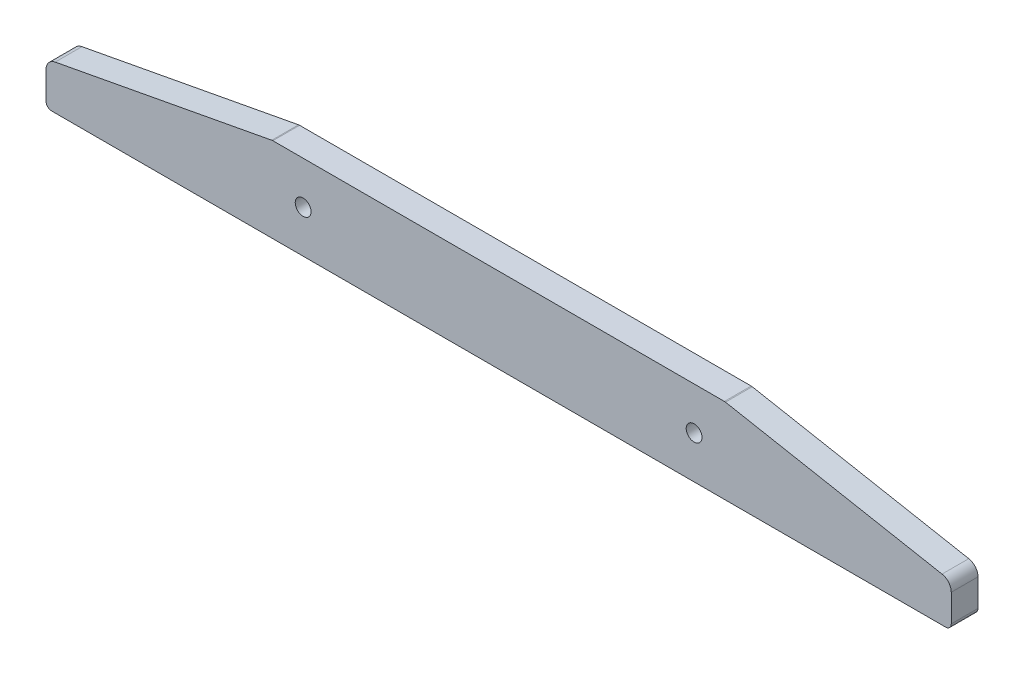
ISO-10303-21;
HEADER;
FILE_DESCRIPTION(('STEP AP214'),'2;1');
FILE_NAME('part.step','',(''),(''),'','','');
FILE_SCHEMA(('AUTOMOTIVE_DESIGN { 1 0 10303 214 1 1 1 1 }'));
ENDSEC;
DATA;
#1=APPLICATION_CONTEXT('core data for automotive mechanical design processes');
#2=APPLICATION_PROTOCOL_DEFINITION('international standard','automotive_design',2000,#1);
#3=PRODUCT_CONTEXT('',#1,'mechanical');
#4=PRODUCT('Part','Part','',(#3));
#5=PRODUCT_RELATED_PRODUCT_CATEGORY('part','',(#4));
#6=PRODUCT_DEFINITION_FORMATION('','',#4);
#7=PRODUCT_DEFINITION_CONTEXT('part definition',#1,'design');
#8=PRODUCT_DEFINITION('design','',#6,#7);
#9=PRODUCT_DEFINITION_SHAPE('','',#8);
#10=(LENGTH_UNIT() NAMED_UNIT(*) SI_UNIT(.MILLI.,.METRE.));
#11=(NAMED_UNIT(*) PLANE_ANGLE_UNIT() SI_UNIT($,.RADIAN.));
#12=(NAMED_UNIT(*) SI_UNIT($,.STERADIAN.) SOLID_ANGLE_UNIT());
#13=UNCERTAINTY_MEASURE_WITH_UNIT(LENGTH_MEASURE(1.E-05),#10,'distance_accuracy_value','');
#14=(GEOMETRIC_REPRESENTATION_CONTEXT(3) GLOBAL_UNCERTAINTY_ASSIGNED_CONTEXT((#13)) GLOBAL_UNIT_ASSIGNED_CONTEXT((#10,
#11,#12)) REPRESENTATION_CONTEXT('',''));
#15=CARTESIAN_POINT('',(0.,0.,0.));
#16=DIRECTION('',(0.,0.,1.));
#17=DIRECTION('',(1.,0.,0.));
#18=AXIS2_PLACEMENT_3D('',#15,#16,#17);
#19=CARTESIAN_POINT('',(101.6,0.,6.));
#20=DIRECTION('',(0.,1.,0.));
#21=DIRECTION('',(-1.,0.,0.));
#22=AXIS2_PLACEMENT_3D('',#19,#20,#21);
#23=PLANE('',#22);
#24=DIRECTION('',(1.,0.,0.));
#25=VECTOR('',#24,1.);
#26=CARTESIAN_POINT('',(101.6,0.,6.));
#27=LINE('',#26,#25);
#28=CARTESIAN_POINT('',(-100.33,0.,6.));
#29=VERTEX_POINT('',#28);
#30=CARTESIAN_POINT('',(100.33,0.,6.));
#31=VERTEX_POINT('',#30);
#32=EDGE_CURVE('E156',#29,#31,#27,.T.);
#33=ORIENTED_EDGE('',*,*,#32,.F.);
#34=DIRECTION('',(0.,0.,-1.));
#35=VECTOR('',#34,1.);
#36=CARTESIAN_POINT('',(-100.33,0.,0.));
#37=LINE('',#36,#35);
#38=CARTESIAN_POINT('',(-100.33,0.,0.));
#39=VERTEX_POINT('',#38);
#40=EDGE_CURVE('E176',#29,#39,#37,.T.);
#41=ORIENTED_EDGE('',*,*,#40,.T.);
#42=DIRECTION('',(1.,0.,0.));
#43=VECTOR('',#42,1.);
#44=CARTESIAN_POINT('',(101.6,0.,0.));
#45=LINE('',#44,#43);
#46=CARTESIAN_POINT('',(100.33,0.,0.));
#47=VERTEX_POINT('',#46);
#48=EDGE_CURVE('E158',#39,#47,#45,.T.);
#49=ORIENTED_EDGE('',*,*,#48,.T.);
#50=DIRECTION('',(0.,0.,-1.));
#51=VECTOR('',#50,1.);
#52=CARTESIAN_POINT('',(100.33,0.,6.));
#53=LINE('',#52,#51);
#54=EDGE_CURVE('E174',#47,#31,#53,.F.);
#55=ORIENTED_EDGE('',*,*,#54,.T.);
#56=EDGE_LOOP('',(#33,#41,#49,#55));
#57=FACE_BOUND('',#56,.T.);
#58=ADVANCED_FACE('F34',(#57),#23,.F.);
#59=CARTESIAN_POINT('',(101.6,9.525,6.));
#60=DIRECTION('',(-1.,0.,0.));
#61=DIRECTION('',(0.,0.,1.));
#62=AXIS2_PLACEMENT_3D('',#59,#60,#61);
#63=PLANE('',#62);
#64=DIRECTION('',(0.,1.,0.));
#65=VECTOR('',#64,1.);
#66=CARTESIAN_POINT('',(101.6,9.525,6.));
#67=LINE('',#66,#65);
#68=CARTESIAN_POINT('',(101.6,1.27,6.));
#69=VERTEX_POINT('',#68);
#70=CARTESIAN_POINT('',(101.6,7.41698723036917,6.));
#71=VERTEX_POINT('',#70);
#72=EDGE_CURVE('E205',#69,#71,#67,.T.);
#73=ORIENTED_EDGE('',*,*,#72,.F.);
#74=DIRECTION('',(0.,0.,-1.));
#75=VECTOR('',#74,1.);
#76=CARTESIAN_POINT('',(101.6,1.27,6.));
#77=LINE('',#76,#75);
#78=CARTESIAN_POINT('',(101.6,1.27,0.));
#79=VERTEX_POINT('',#78);
#80=EDGE_CURVE('E11',#69,#79,#77,.T.);
#81=ORIENTED_EDGE('',*,*,#80,.T.);
#82=DIRECTION('',(0.,1.,0.));
#83=VECTOR('',#82,1.);
#84=CARTESIAN_POINT('',(101.6,9.525,0.));
#85=LINE('',#84,#83);
#86=CARTESIAN_POINT('',(101.6,7.41698723036917,0.));
#87=VERTEX_POINT('',#86);
#88=EDGE_CURVE('E154',#79,#87,#85,.T.);
#89=ORIENTED_EDGE('',*,*,#88,.T.);
#90=DIRECTION('',(0.,0.,-1.));
#91=VECTOR('',#90,1.);
#92=CARTESIAN_POINT('',(101.6,7.41698723036917,6.));
#93=LINE('',#92,#91);
#94=EDGE_CURVE('E133',#87,#71,#93,.F.);
#95=ORIENTED_EDGE('',*,*,#94,.T.);
#96=EDGE_LOOP('',(#73,#81,#89,#95));
#97=FACE_BOUND('',#96,.T.);
#98=ADVANCED_FACE('F245',(#97),#63,.F.);
#99=CARTESIAN_POINT('',(50.8,19.05,6.));
#100=DIRECTION('',(-0.184288535050185,-0.982872186934322,0.));
#101=DIRECTION('',(0.982872186934322,-0.184288535050185,0.));
#102=AXIS2_PLACEMENT_3D('',#99,#100,#101);
#103=PLANE('',#102);
#104=DIRECTION('',(-0.982872186934322,0.184288535050185,0.));
#105=VECTOR('',#104,1.);
#106=CARTESIAN_POINT('',(50.8,19.05,0.));
#107=LINE('',#106,#105);
#108=CARTESIAN_POINT('',(99.5280928790274,9.91348258518235,0.));
#109=VERTEX_POINT('',#108);
#110=CARTESIAN_POINT('',(50.9160123871649,19.0282476774066,0.));
#111=VERTEX_POINT('',#110);
#112=EDGE_CURVE('E143',#109,#111,#107,.T.);
#113=ORIENTED_EDGE('',*,*,#112,.T.);
#114=DIRECTION('',(0.,0.,-1.));
#115=VECTOR('',#114,1.);
#116=CARTESIAN_POINT('',(50.9160123871649,19.0282476774066,6.));
#117=LINE('',#116,#115);
#118=CARTESIAN_POINT('',(50.9160123871649,19.0282476774066,6.));
#119=VERTEX_POINT('',#118);
#120=EDGE_CURVE('E42',#111,#119,#117,.F.);
#121=ORIENTED_EDGE('',*,*,#120,.T.);
#122=DIRECTION('',(-0.982872186934322,0.184288535050185,0.));
#123=VECTOR('',#122,1.);
#124=CARTESIAN_POINT('',(50.8,19.05,6.));
#125=LINE('',#124,#123);
#126=CARTESIAN_POINT('',(99.5280928790274,9.91348258518235,6.));
#127=VERTEX_POINT('',#126);
#128=EDGE_CURVE('E146',#127,#119,#125,.T.);
#129=ORIENTED_EDGE('',*,*,#128,.F.);
#130=DIRECTION('',(0.,0.,-1.));
#131=VECTOR('',#130,1.);
#132=CARTESIAN_POINT('',(99.5280928790274,9.91348258518235,6.));
#133=LINE('',#132,#131);
#134=EDGE_CURVE('E131',#127,#109,#133,.T.);
#135=ORIENTED_EDGE('',*,*,#134,.T.);
#136=EDGE_LOOP('',(#113,#121,#129,#135));
#137=FACE_BOUND('',#136,.T.);
#138=ADVANCED_FACE('F142',(#137),#103,.F.);
#139=CARTESIAN_POINT('',(0.,19.05,6.));
#140=DIRECTION('',(0.,-1.,0.));
#141=DIRECTION('',(0.,0.,-1.));
#142=AXIS2_PLACEMENT_3D('',#139,#140,#141);
#143=PLANE('',#142);
#144=DIRECTION('',(-1.,0.,0.));
#145=VECTOR('',#144,1.);
#146=CARTESIAN_POINT('',(0.,19.05,0.));
#147=LINE('',#146,#145);
#148=CARTESIAN_POINT('',(50.6819659476511,19.05,0.));
#149=VERTEX_POINT('',#148);
#150=CARTESIAN_POINT('',(-50.6819659476511,19.05,0.));
#151=VERTEX_POINT('',#150);
#152=EDGE_CURVE('E153',#149,#151,#147,.T.);
#153=ORIENTED_EDGE('',*,*,#152,.T.);
#154=DIRECTION('',(0.,0.,-1.));
#155=VECTOR('',#154,1.);
#156=CARTESIAN_POINT('',(-50.6819659476511,19.05,6.));
#157=LINE('',#156,#155);
#158=CARTESIAN_POINT('',(-50.6819659476511,19.05,6.));
#159=VERTEX_POINT('',#158);
#160=EDGE_CURVE('E57',#151,#159,#157,.F.);
#161=ORIENTED_EDGE('',*,*,#160,.T.);
#162=DIRECTION('',(-1.,0.,0.));
#163=VECTOR('',#162,1.);
#164=CARTESIAN_POINT('',(0.,19.05,6.));
#165=LINE('',#164,#163);
#166=CARTESIAN_POINT('',(50.6819659476511,19.05,6.));
#167=VERTEX_POINT('',#166);
#168=EDGE_CURVE('E147',#167,#159,#165,.T.);
#169=ORIENTED_EDGE('',*,*,#168,.F.);
#170=DIRECTION('',(0.,0.,-1.));
#171=VECTOR('',#170,1.);
#172=CARTESIAN_POINT('',(50.6819659476511,19.05,6.));
#173=LINE('',#172,#171);
#174=EDGE_CURVE('E198',#167,#149,#173,.T.);
#175=ORIENTED_EDGE('',*,*,#174,.T.);
#176=EDGE_LOOP('',(#153,#161,#169,#175));
#177=FACE_BOUND('',#176,.T.);
#178=ADVANCED_FACE('F209',(#177),#143,.F.);
#179=CARTESIAN_POINT('',(0.,0.,6.));
#180=DIRECTION('',(0.,0.,-1.));
#181=DIRECTION('',(-1.,0.,0.));
#182=AXIS2_PLACEMENT_3D('',#179,#180,#181);
#183=PLANE('',#182);
#184=CARTESIAN_POINT('',(43.8785,9.525,6.));
#185=DIRECTION('',(0.,0.,1.));
#186=DIRECTION('',(1.,0.,0.));
#187=AXIS2_PLACEMENT_3D('',#184,#185,#186);
#188=CIRCLE('',#187,1.778);
#189=CARTESIAN_POINT('',(45.6565,9.525,6.));
#190=VERTEX_POINT('',#189);
#191=EDGE_CURVE('E405',#190,#190,#188,.T.);
#192=ORIENTED_EDGE('',*,*,#191,.F.);
#193=EDGE_LOOP('',(#192));
#194=FACE_BOUND('',#193,.T.);
#195=CARTESIAN_POINT('',(-43.8785,9.52499999999999,6.));
#196=DIRECTION('',(0.,0.,1.));
#197=DIRECTION('',(1.,0.,0.));
#198=AXIS2_PLACEMENT_3D('',#195,#196,#197);
#199=CIRCLE('',#198,1.778);
#200=CARTESIAN_POINT('',(-42.1005,9.52499999999999,6.));
#201=VERTEX_POINT('',#200);
#202=EDGE_CURVE('E227',#201,#201,#199,.T.);
#203=ORIENTED_EDGE('',*,*,#202,.F.);
#204=EDGE_LOOP('',(#203));
#205=FACE_BOUND('',#204,.T.);
#206=DIRECTION('',(0.,1.,0.));
#207=VECTOR('',#206,1.);
#208=CARTESIAN_POINT('',(-101.6,9.525,6.));
#209=LINE('',#208,#207);
#210=CARTESIAN_POINT('',(-101.6,1.27,6.));
#211=VERTEX_POINT('',#210);
#212=CARTESIAN_POINT('',(-101.6,7.41698723036917,6.));
#213=VERTEX_POINT('',#212);
#214=EDGE_CURVE('E221',#211,#213,#209,.T.);
#215=ORIENTED_EDGE('',*,*,#214,.F.);
#216=CARTESIAN_POINT('',(-100.33,1.27,6.));
#217=DIRECTION('',(0.,0.,-1.));
#218=DIRECTION('',(-1.,0.,0.));
#219=AXIS2_PLACEMENT_3D('',#216,#217,#218);
#220=CIRCLE('',#219,1.27);
#221=EDGE_CURVE('E193',#211,#29,#220,.F.);
#222=ORIENTED_EDGE('',*,*,#221,.T.);
#223=ORIENTED_EDGE('',*,*,#32,.T.);
#224=CARTESIAN_POINT('',(100.33,1.27,6.));
#225=DIRECTION('',(0.,0.,-1.));
#226=DIRECTION('',(-1.,0.,0.));
#227=AXIS2_PLACEMENT_3D('',#224,#225,#226);
#228=CIRCLE('',#227,1.27);
#229=EDGE_CURVE('E188',#31,#69,#228,.F.);
#230=ORIENTED_EDGE('',*,*,#229,.T.);
#231=ORIENTED_EDGE('',*,*,#72,.T.);
#232=CARTESIAN_POINT('',(99.06,7.41698723036917,6.));
#233=DIRECTION('',(0.,0.,-1.));
#234=DIRECTION('',(-1.,0.,0.));
#235=AXIS2_PLACEMENT_3D('',#232,#233,#234);
#236=CIRCLE('',#235,2.54);
#237=EDGE_CURVE('E167',#71,#127,#236,.F.);
#238=ORIENTED_EDGE('',*,*,#237,.T.);
#239=ORIENTED_EDGE('',*,*,#128,.T.);
#240=CARTESIAN_POINT('',(50.6819659476511,17.78,6.));
#241=DIRECTION('',(0.,0.,-1.));
#242=DIRECTION('',(-1.,0.,0.));
#243=AXIS2_PLACEMENT_3D('',#240,#241,#242);
#244=CIRCLE('',#243,1.27);
#245=EDGE_CURVE('E190',#119,#167,#244,.F.);
#246=ORIENTED_EDGE('',*,*,#245,.T.);
#247=ORIENTED_EDGE('',*,*,#168,.T.);
#248=CARTESIAN_POINT('',(-50.6819659476511,17.78,6.));
#249=DIRECTION('',(0.,0.,-1.));
#250=DIRECTION('',(-1.,0.,0.));
#251=AXIS2_PLACEMENT_3D('',#248,#249,#250);
#252=CIRCLE('',#251,1.27);
#253=CARTESIAN_POINT('',(-50.9160123871649,19.0282476774066,6.));
#254=VERTEX_POINT('',#253);
#255=EDGE_CURVE('E49',#159,#254,#252,.F.);
#256=ORIENTED_EDGE('',*,*,#255,.T.);
#257=DIRECTION('',(0.982872186934322,0.184288535050185,0.));
#258=VECTOR('',#257,1.);
#259=CARTESIAN_POINT('',(-50.8,19.05,6.));
#260=LINE('',#259,#258);
#261=CARTESIAN_POINT('',(-99.5280928790274,9.91348258518235,6.));
#262=VERTEX_POINT('',#261);
#263=EDGE_CURVE('E219',#262,#254,#260,.T.);
#264=ORIENTED_EDGE('',*,*,#263,.F.);
#265=CARTESIAN_POINT('',(-99.06,7.41698723036917,6.));
#266=DIRECTION('',(0.,0.,-1.));
#267=DIRECTION('',(-1.,0.,0.));
#268=AXIS2_PLACEMENT_3D('',#265,#266,#267);
#269=CIRCLE('',#268,2.54);
#270=EDGE_CURVE('E164',#262,#213,#269,.F.);
#271=ORIENTED_EDGE('',*,*,#270,.T.);
#272=EDGE_LOOP('',(#215,#222,#223,#230,#231,#238,#239,#246,#247,#256,#264,#271));
#273=FACE_BOUND('',#272,.T.);
#274=ADVANCED_FACE('F204',(#194,#205,#273),#183,.F.);
#275=CARTESIAN_POINT('',(0.,0.,0.));
#276=DIRECTION('',(0.,0.,-1.));
#277=DIRECTION('',(-1.,0.,0.));
#278=AXIS2_PLACEMENT_3D('',#275,#276,#277);
#279=PLANE('',#278);
#280=CARTESIAN_POINT('',(43.8785,9.525,0.));
#281=DIRECTION('',(0.,0.,1.));
#282=DIRECTION('',(1.,0.,0.));
#283=AXIS2_PLACEMENT_3D('',#280,#281,#282);
#284=CIRCLE('',#283,1.778);
#285=CARTESIAN_POINT('',(45.6565,9.525,0.));
#286=VERTEX_POINT('',#285);
#287=EDGE_CURVE('E401',#286,#286,#284,.T.);
#288=ORIENTED_EDGE('',*,*,#287,.T.);
#289=EDGE_LOOP('',(#288));
#290=FACE_BOUND('',#289,.T.);
#291=CARTESIAN_POINT('',(-43.8785,9.52499999999999,0.));
#292=DIRECTION('',(0.,0.,1.));
#293=DIRECTION('',(1.,0.,0.));
#294=AXIS2_PLACEMENT_3D('',#291,#292,#293);
#295=CIRCLE('',#294,1.778);
#296=CARTESIAN_POINT('',(-42.1005,9.52499999999999,0.));
#297=VERTEX_POINT('',#296);
#298=EDGE_CURVE('E230',#297,#297,#295,.T.);
#299=ORIENTED_EDGE('',*,*,#298,.T.);
#300=EDGE_LOOP('',(#299));
#301=FACE_BOUND('',#300,.T.);
#302=ORIENTED_EDGE('',*,*,#48,.F.);
#303=CARTESIAN_POINT('',(-100.33,1.27,0.));
#304=DIRECTION('',(0.,0.,-1.));
#305=DIRECTION('',(-1.,0.,0.));
#306=AXIS2_PLACEMENT_3D('',#303,#304,#305);
#307=CIRCLE('',#306,1.27);
#308=CARTESIAN_POINT('',(-101.6,1.27,0.));
#309=VERTEX_POINT('',#308);
#310=EDGE_CURVE('E184',#39,#309,#307,.T.);
#311=ORIENTED_EDGE('',*,*,#310,.T.);
#312=DIRECTION('',(0.,1.,0.));
#313=VECTOR('',#312,1.);
#314=CARTESIAN_POINT('',(-101.6,9.525,0.));
#315=LINE('',#314,#313);
#316=CARTESIAN_POINT('',(-101.6,7.41698723036917,0.));
#317=VERTEX_POINT('',#316);
#318=EDGE_CURVE('E222',#309,#317,#315,.T.);
#319=ORIENTED_EDGE('',*,*,#318,.T.);
#320=CARTESIAN_POINT('',(-99.06,7.41698723036917,0.));
#321=DIRECTION('',(0.,0.,-1.));
#322=DIRECTION('',(-1.,0.,0.));
#323=AXIS2_PLACEMENT_3D('',#320,#321,#322);
#324=CIRCLE('',#323,2.54);
#325=CARTESIAN_POINT('',(-99.5280928790274,9.91348258518235,0.));
#326=VERTEX_POINT('',#325);
#327=EDGE_CURVE('E137',#317,#326,#324,.T.);
#328=ORIENTED_EDGE('',*,*,#327,.T.);
#329=DIRECTION('',(0.982872186934322,0.184288535050185,0.));
#330=VECTOR('',#329,1.);
#331=CARTESIAN_POINT('',(-50.8,19.05,0.));
#332=LINE('',#331,#330);
#333=CARTESIAN_POINT('',(-50.9160123871649,19.0282476774066,0.));
#334=VERTEX_POINT('',#333);
#335=EDGE_CURVE('E212',#326,#334,#332,.T.);
#336=ORIENTED_EDGE('',*,*,#335,.T.);
#337=CARTESIAN_POINT('',(-50.6819659476511,17.78,0.));
#338=DIRECTION('',(0.,0.,-1.));
#339=DIRECTION('',(-1.,0.,0.));
#340=AXIS2_PLACEMENT_3D('',#337,#338,#339);
#341=CIRCLE('',#340,1.27);
#342=EDGE_CURVE('E182',#334,#151,#341,.T.);
#343=ORIENTED_EDGE('',*,*,#342,.T.);
#344=ORIENTED_EDGE('',*,*,#152,.F.);
#345=CARTESIAN_POINT('',(50.6819659476511,17.78,0.));
#346=DIRECTION('',(0.,0.,-1.));
#347=DIRECTION('',(-1.,0.,0.));
#348=AXIS2_PLACEMENT_3D('',#345,#346,#347);
#349=CIRCLE('',#348,1.27);
#350=EDGE_CURVE('E152',#149,#111,#349,.T.);
#351=ORIENTED_EDGE('',*,*,#350,.T.);
#352=ORIENTED_EDGE('',*,*,#112,.F.);
#353=CARTESIAN_POINT('',(99.06,7.41698723036917,0.));
#354=DIRECTION('',(0.,0.,-1.));
#355=DIRECTION('',(-1.,0.,0.));
#356=AXIS2_PLACEMENT_3D('',#353,#354,#355);
#357=CIRCLE('',#356,2.54);
#358=EDGE_CURVE('E127',#109,#87,#357,.T.);
#359=ORIENTED_EDGE('',*,*,#358,.T.);
#360=ORIENTED_EDGE('',*,*,#88,.F.);
#361=CARTESIAN_POINT('',(100.33,1.27,0.));
#362=DIRECTION('',(0.,0.,-1.));
#363=DIRECTION('',(-1.,0.,0.));
#364=AXIS2_PLACEMENT_3D('',#361,#362,#363);
#365=CIRCLE('',#364,1.27);
#366=EDGE_CURVE('E179',#79,#47,#365,.T.);
#367=ORIENTED_EDGE('',*,*,#366,.T.);
#368=EDGE_LOOP('',(#302,#311,#319,#328,#336,#343,#344,#351,#352,#359,#360,#367));
#369=FACE_BOUND('',#368,.T.);
#370=ADVANCED_FACE('F150',(#290,#301,#369),#279,.T.);
#371=CARTESIAN_POINT('',(-50.8,19.05,6.));
#372=DIRECTION('',(-0.184288535050185,0.982872186934322,0.));
#373=DIRECTION('',(-0.982872186934322,-0.184288535050185,0.));
#374=AXIS2_PLACEMENT_3D('',#371,#372,#373);
#375=PLANE('',#374);
#376=ORIENTED_EDGE('',*,*,#263,.T.);
#377=DIRECTION('',(0.,0.,-1.));
#378=VECTOR('',#377,1.);
#379=CARTESIAN_POINT('',(-50.9160123871649,19.0282476774066,0.));
#380=LINE('',#379,#378);
#381=EDGE_CURVE('E195',#254,#334,#380,.T.);
#382=ORIENTED_EDGE('',*,*,#381,.T.);
#383=ORIENTED_EDGE('',*,*,#335,.F.);
#384=DIRECTION('',(0.,0.,-1.));
#385=VECTOR('',#384,1.);
#386=CARTESIAN_POINT('',(-99.5280928790274,9.91348258518235,6.));
#387=LINE('',#386,#385);
#388=EDGE_CURVE('E172',#326,#262,#387,.F.);
#389=ORIENTED_EDGE('',*,*,#388,.T.);
#390=EDGE_LOOP('',(#376,#382,#383,#389));
#391=FACE_BOUND('',#390,.T.);
#392=ADVANCED_FACE('F217',(#391),#375,.T.);
#393=CARTESIAN_POINT('',(-101.6,9.525,6.));
#394=DIRECTION('',(-1.,0.,0.));
#395=DIRECTION('',(0.,0.,1.));
#396=AXIS2_PLACEMENT_3D('',#393,#394,#395);
#397=PLANE('',#396);
#398=ORIENTED_EDGE('',*,*,#318,.F.);
#399=DIRECTION('',(0.,0.,-1.));
#400=VECTOR('',#399,1.);
#401=CARTESIAN_POINT('',(-101.6,1.27,6.));
#402=LINE('',#401,#400);
#403=EDGE_CURVE('E186',#309,#211,#402,.F.);
#404=ORIENTED_EDGE('',*,*,#403,.T.);
#405=ORIENTED_EDGE('',*,*,#214,.T.);
#406=DIRECTION('',(0.,0.,-1.));
#407=VECTOR('',#406,1.);
#408=CARTESIAN_POINT('',(-101.6,7.41698723036917,6.));
#409=LINE('',#408,#407);
#410=EDGE_CURVE('E169',#213,#317,#409,.T.);
#411=ORIENTED_EDGE('',*,*,#410,.T.);
#412=EDGE_LOOP('',(#398,#404,#405,#411));
#413=FACE_BOUND('',#412,.T.);
#414=ADVANCED_FACE('F259',(#413),#397,.T.);
#415=CARTESIAN_POINT('',(99.06,7.41698723036917,6.));
#416=DIRECTION('',(0.,0.,-1.));
#417=DIRECTION('',(-1.,0.,0.));
#418=AXIS2_PLACEMENT_3D('',#415,#416,#417);
#419=CYLINDRICAL_SURFACE('',#418,2.54);
#420=ORIENTED_EDGE('',*,*,#237,.F.);
#421=ORIENTED_EDGE('',*,*,#94,.F.);
#422=ORIENTED_EDGE('',*,*,#358,.F.);
#423=ORIENTED_EDGE('',*,*,#134,.F.);
#424=EDGE_LOOP('',(#420,#421,#422,#423));
#425=FACE_BOUND('',#424,.T.);
#426=ADVANCED_FACE('F130',(#425),#419,.T.);
#427=CARTESIAN_POINT('',(-99.06,7.41698723036917,6.));
#428=DIRECTION('',(0.,0.,-1.));
#429=DIRECTION('',(-1.,0.,0.));
#430=AXIS2_PLACEMENT_3D('',#427,#428,#429);
#431=CYLINDRICAL_SURFACE('',#430,2.54);
#432=ORIENTED_EDGE('',*,*,#270,.F.);
#433=ORIENTED_EDGE('',*,*,#388,.F.);
#434=ORIENTED_EDGE('',*,*,#327,.F.);
#435=ORIENTED_EDGE('',*,*,#410,.F.);
#436=EDGE_LOOP('',(#432,#433,#434,#435));
#437=FACE_BOUND('',#436,.T.);
#438=ADVANCED_FACE('F258',(#437),#431,.T.);
#439=CARTESIAN_POINT('',(-100.33,1.27,6.));
#440=DIRECTION('',(0.,0.,1.));
#441=DIRECTION('',(1.,0.,0.));
#442=AXIS2_PLACEMENT_3D('',#439,#440,#441);
#443=CYLINDRICAL_SURFACE('',#442,1.27);
#444=ORIENTED_EDGE('',*,*,#221,.F.);
#445=ORIENTED_EDGE('',*,*,#403,.F.);
#446=ORIENTED_EDGE('',*,*,#310,.F.);
#447=ORIENTED_EDGE('',*,*,#40,.F.);
#448=EDGE_LOOP('',(#444,#445,#446,#447));
#449=FACE_BOUND('',#448,.T.);
#450=ADVANCED_FACE('F262',(#449),#443,.T.);
#451=CARTESIAN_POINT('',(-50.6819659476511,17.78,6.));
#452=DIRECTION('',(0.,0.,1.));
#453=DIRECTION('',(1.,0.,0.));
#454=AXIS2_PLACEMENT_3D('',#451,#452,#453);
#455=CYLINDRICAL_SURFACE('',#454,1.27);
#456=ORIENTED_EDGE('',*,*,#255,.F.);
#457=ORIENTED_EDGE('',*,*,#160,.F.);
#458=ORIENTED_EDGE('',*,*,#342,.F.);
#459=ORIENTED_EDGE('',*,*,#381,.F.);
#460=EDGE_LOOP('',(#456,#457,#458,#459));
#461=FACE_BOUND('',#460,.T.);
#462=ADVANCED_FACE('F215',(#461),#455,.T.);
#463=CARTESIAN_POINT('',(50.6819659476511,17.78,6.));
#464=DIRECTION('',(0.,0.,-1.));
#465=DIRECTION('',(-1.,0.,0.));
#466=AXIS2_PLACEMENT_3D('',#463,#464,#465);
#467=CYLINDRICAL_SURFACE('',#466,1.27);
#468=ORIENTED_EDGE('',*,*,#245,.F.);
#469=ORIENTED_EDGE('',*,*,#120,.F.);
#470=ORIENTED_EDGE('',*,*,#350,.F.);
#471=ORIENTED_EDGE('',*,*,#174,.F.);
#472=EDGE_LOOP('',(#468,#469,#470,#471));
#473=FACE_BOUND('',#472,.T.);
#474=ADVANCED_FACE('F208',(#473),#467,.T.);
#475=CARTESIAN_POINT('',(100.33,1.27,6.));
#476=DIRECTION('',(0.,0.,-1.));
#477=DIRECTION('',(-1.,0.,0.));
#478=AXIS2_PLACEMENT_3D('',#475,#476,#477);
#479=CYLINDRICAL_SURFACE('',#478,1.27);
#480=ORIENTED_EDGE('',*,*,#229,.F.);
#481=ORIENTED_EDGE('',*,*,#54,.F.);
#482=ORIENTED_EDGE('',*,*,#366,.F.);
#483=ORIENTED_EDGE('',*,*,#80,.F.);
#484=EDGE_LOOP('',(#480,#481,#482,#483));
#485=FACE_BOUND('',#484,.T.);
#486=ADVANCED_FACE('F36',(#485),#479,.T.);
#487=CARTESIAN_POINT('',(-43.8785,9.52499999999999,0.));
#488=DIRECTION('',(0.,0.,1.));
#489=DIRECTION('',(1.,0.,0.));
#490=AXIS2_PLACEMENT_3D('',#487,#488,#489);
#491=CYLINDRICAL_SURFACE('',#490,1.778);
#492=ORIENTED_EDGE('',*,*,#298,.F.);
#493=EDGE_LOOP('',(#492));
#494=FACE_BOUND('',#493,.T.);
#495=ORIENTED_EDGE('',*,*,#202,.T.);
#496=EDGE_LOOP('',(#495));
#497=FACE_BOUND('',#496,.T.);
#498=ADVANCED_FACE('F272',(#494,#497),#491,.F.);
#499=CARTESIAN_POINT('',(43.8785,9.525,0.));
#500=DIRECTION('',(0.,0.,1.));
#501=DIRECTION('',(1.,0.,0.));
#502=AXIS2_PLACEMENT_3D('',#499,#500,#501);
#503=CYLINDRICAL_SURFACE('',#502,1.778);
#504=ORIENTED_EDGE('',*,*,#287,.F.);
#505=EDGE_LOOP('',(#504));
#506=FACE_BOUND('',#505,.T.);
#507=ORIENTED_EDGE('',*,*,#191,.T.);
#508=EDGE_LOOP('',(#507));
#509=FACE_BOUND('',#508,.T.);
#510=ADVANCED_FACE('F276',(#506,#509),#503,.F.);
#511=CLOSED_SHELL('',(#58,#98,#138,#178,#274,#370,#392,#414,#426,#438,#450,#462,#474,#486,#498,#510));
#512=MANIFOLD_SOLID_BREP('B2',#511);
#513=ADVANCED_BREP_SHAPE_REPRESENTATION('',(#18,#512),#14);
#514=SHAPE_DEFINITION_REPRESENTATION(#9,#513);
ENDSEC;
END-ISO-10303-21;
